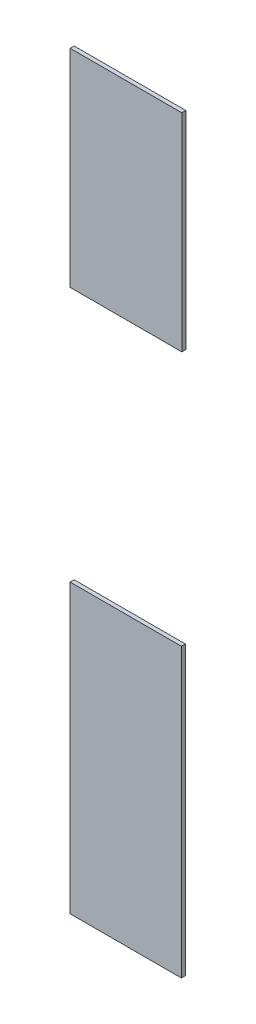
ISO-10303-21;
HEADER;
FILE_DESCRIPTION(('STEP AP214'),'2;1');
FILE_NAME('part.step','',(''),(''),'','','');
FILE_SCHEMA(('AUTOMOTIVE_DESIGN { 1 0 10303 214 1 1 1 1 }'));
ENDSEC;
DATA;
#1=APPLICATION_CONTEXT('core data for automotive mechanical design processes');
#2=APPLICATION_PROTOCOL_DEFINITION('international standard','automotive_design',2000,#1);
#3=PRODUCT_CONTEXT('',#1,'mechanical');
#4=PRODUCT('Part','Part','',(#3));
#5=PRODUCT_RELATED_PRODUCT_CATEGORY('part','',(#4));
#6=PRODUCT_DEFINITION_FORMATION('','',#4);
#7=PRODUCT_DEFINITION_CONTEXT('part definition',#1,'design');
#8=PRODUCT_DEFINITION('design','',#6,#7);
#9=PRODUCT_DEFINITION_SHAPE('','',#8);
#10=(LENGTH_UNIT() NAMED_UNIT(*) SI_UNIT(.MILLI.,.METRE.));
#11=(NAMED_UNIT(*) PLANE_ANGLE_UNIT() SI_UNIT($,.RADIAN.));
#12=(NAMED_UNIT(*) SI_UNIT($,.STERADIAN.) SOLID_ANGLE_UNIT());
#13=UNCERTAINTY_MEASURE_WITH_UNIT(LENGTH_MEASURE(1.E-05),#10,'distance_accuracy_value','');
#14=(GEOMETRIC_REPRESENTATION_CONTEXT(3) GLOBAL_UNCERTAINTY_ASSIGNED_CONTEXT((#13)) GLOBAL_UNIT_ASSIGNED_CONTEXT((#10,
#11,#12)) REPRESENTATION_CONTEXT('',''));
#15=CARTESIAN_POINT('',(0.,0.,0.));
#16=DIRECTION('',(0.,0.,1.));
#17=DIRECTION('',(1.,0.,0.));
#18=AXIS2_PLACEMENT_3D('',#15,#16,#17);
#19=CARTESIAN_POINT('',(-1.50000000000043,-1449.25,12.5));
#20=DIRECTION('',(-1.,0.,0.));
#21=DIRECTION('',(0.,0.,1.));
#22=AXIS2_PLACEMENT_3D('',#19,#20,#21);
#23=PLANE('',#22);
#24=DIRECTION('',(0.,1.,0.));
#25=VECTOR('',#24,1.);
#26=CARTESIAN_POINT('',(-1.50000000000043,-1449.25,0.));
#27=LINE('',#26,#25);
#28=CARTESIAN_POINT('',(-1.50000000000043,-2350.,0.));
#29=VERTEX_POINT('',#28);
#30=CARTESIAN_POINT('',(-1.50000000000043,-1449.25,0.));
#31=VERTEX_POINT('',#30);
#32=EDGE_CURVE('E108',#29,#31,#27,.T.);
#33=ORIENTED_EDGE('',*,*,#32,.T.);
#34=DIRECTION('',(0.,0.,-1.));
#35=VECTOR('',#34,1.);
#36=CARTESIAN_POINT('',(-1.50000000000043,-1449.25,12.5));
#37=LINE('',#36,#35);
#38=CARTESIAN_POINT('',(-1.50000000000043,-1449.25,12.5));
#39=VERTEX_POINT('',#38);
#40=EDGE_CURVE('E12',#39,#31,#37,.T.);
#41=ORIENTED_EDGE('',*,*,#40,.F.);
#42=DIRECTION('',(0.,1.,0.));
#43=VECTOR('',#42,1.);
#44=CARTESIAN_POINT('',(-1.50000000000043,-1449.25,12.5));
#45=LINE('',#44,#43);
#46=CARTESIAN_POINT('',(-1.50000000000043,-2350.,12.5));
#47=VERTEX_POINT('',#46);
#48=EDGE_CURVE('E96',#47,#39,#45,.T.);
#49=ORIENTED_EDGE('',*,*,#48,.F.);
#50=DIRECTION('',(0.,0.,-1.));
#51=VECTOR('',#50,1.);
#52=CARTESIAN_POINT('',(-1.50000000000043,-2350.,12.5));
#53=LINE('',#52,#51);
#54=EDGE_CURVE('E104',#47,#29,#53,.T.);
#55=ORIENTED_EDGE('',*,*,#54,.T.);
#56=EDGE_LOOP('',(#33,#41,#49,#55));
#57=FACE_BOUND('',#56,.T.);
#58=ADVANCED_FACE('F45',(#57),#23,.F.);
#59=CARTESIAN_POINT('',(-1.50000000000043,-1449.25,12.5));
#60=DIRECTION('',(0.,-1.,0.));
#61=DIRECTION('',(0.,0.,-1.));
#62=AXIS2_PLACEMENT_3D('',#59,#60,#61);
#63=PLANE('',#62);
#64=DIRECTION('',(-1.,0.,0.));
#65=VECTOR('',#64,1.);
#66=CARTESIAN_POINT('',(-1.50000000000043,-1449.25,0.));
#67=LINE('',#66,#65);
#68=CARTESIAN_POINT('',(-350.000000000002,-1449.25,0.));
#69=VERTEX_POINT('',#68);
#70=EDGE_CURVE('E100',#31,#69,#67,.T.);
#71=ORIENTED_EDGE('',*,*,#70,.T.);
#72=DIRECTION('',(0.,0.,-1.));
#73=VECTOR('',#72,1.);
#74=CARTESIAN_POINT('',(-350.000000000002,-1449.25,12.5));
#75=LINE('',#74,#73);
#76=CARTESIAN_POINT('',(-350.000000000002,-1449.25,12.5));
#77=VERTEX_POINT('',#76);
#78=EDGE_CURVE('E53',#77,#69,#75,.T.);
#79=ORIENTED_EDGE('',*,*,#78,.F.);
#80=DIRECTION('',(-1.,0.,0.));
#81=VECTOR('',#80,1.);
#82=CARTESIAN_POINT('',(-1.50000000000043,-1449.25,12.5));
#83=LINE('',#82,#81);
#84=EDGE_CURVE('E91',#39,#77,#83,.T.);
#85=ORIENTED_EDGE('',*,*,#84,.F.);
#86=ORIENTED_EDGE('',*,*,#40,.T.);
#87=EDGE_LOOP('',(#71,#79,#85,#86));
#88=FACE_BOUND('',#87,.T.);
#89=ADVANCED_FACE('F99',(#88),#63,.F.);
#90=CARTESIAN_POINT('',(-350.000000000002,-1449.25,12.5));
#91=DIRECTION('',(1.,0.,0.));
#92=DIRECTION('',(0.,0.,-1.));
#93=AXIS2_PLACEMENT_3D('',#90,#91,#92);
#94=PLANE('',#93);
#95=DIRECTION('',(0.,-1.,0.));
#96=VECTOR('',#95,1.);
#97=CARTESIAN_POINT('',(-350.000000000002,-1449.25,0.));
#98=LINE('',#97,#96);
#99=CARTESIAN_POINT('',(-350.000000000002,-2350.,0.));
#100=VERTEX_POINT('',#99);
#101=EDGE_CURVE('E78',#69,#100,#98,.T.);
#102=ORIENTED_EDGE('',*,*,#101,.T.);
#103=DIRECTION('',(0.,0.,-1.));
#104=VECTOR('',#103,1.);
#105=CARTESIAN_POINT('',(-350.000000000002,-2350.,12.5));
#106=LINE('',#105,#104);
#107=CARTESIAN_POINT('',(-350.000000000002,-2350.,12.5));
#108=VERTEX_POINT('',#107);
#109=EDGE_CURVE('E101',#108,#100,#106,.T.);
#110=ORIENTED_EDGE('',*,*,#109,.F.);
#111=DIRECTION('',(0.,-1.,0.));
#112=VECTOR('',#111,1.);
#113=CARTESIAN_POINT('',(-350.000000000002,-1449.25,12.5));
#114=LINE('',#113,#112);
#115=EDGE_CURVE('E94',#77,#108,#114,.T.);
#116=ORIENTED_EDGE('',*,*,#115,.F.);
#117=ORIENTED_EDGE('',*,*,#78,.T.);
#118=EDGE_LOOP('',(#102,#110,#116,#117));
#119=FACE_BOUND('',#118,.T.);
#120=ADVANCED_FACE('F102',(#119),#94,.F.);
#121=CARTESIAN_POINT('',(-1.50000000000043,-2350.,12.5));
#122=DIRECTION('',(0.,1.,0.));
#123=DIRECTION('',(0.,0.,1.));
#124=AXIS2_PLACEMENT_3D('',#121,#122,#123);
#125=PLANE('',#124);
#126=DIRECTION('',(1.,0.,0.));
#127=VECTOR('',#126,1.);
#128=CARTESIAN_POINT('',(-1.50000000000043,-2350.,0.));
#129=LINE('',#128,#127);
#130=EDGE_CURVE('E84',#100,#29,#129,.T.);
#131=ORIENTED_EDGE('',*,*,#130,.T.);
#132=ORIENTED_EDGE('',*,*,#54,.F.);
#133=DIRECTION('',(1.,0.,0.));
#134=VECTOR('',#133,1.);
#135=CARTESIAN_POINT('',(-1.50000000000043,-2350.,12.5));
#136=LINE('',#135,#134);
#137=EDGE_CURVE('E61',#108,#47,#136,.T.);
#138=ORIENTED_EDGE('',*,*,#137,.F.);
#139=ORIENTED_EDGE('',*,*,#109,.T.);
#140=EDGE_LOOP('',(#131,#132,#138,#139));
#141=FACE_BOUND('',#140,.T.);
#142=ADVANCED_FACE('F115',(#141),#125,.F.);
#143=CARTESIAN_POINT('',(0.,0.,12.5));
#144=DIRECTION('',(0.,0.,-1.));
#145=DIRECTION('',(-1.,0.,0.));
#146=AXIS2_PLACEMENT_3D('',#143,#144,#145);
#147=PLANE('',#146);
#148=ORIENTED_EDGE('',*,*,#48,.T.);
#149=ORIENTED_EDGE('',*,*,#84,.T.);
#150=ORIENTED_EDGE('',*,*,#115,.T.);
#151=ORIENTED_EDGE('',*,*,#137,.T.);
#152=EDGE_LOOP('',(#148,#149,#150,#151));
#153=FACE_BOUND('',#152,.T.);
#154=ADVANCED_FACE('F92',(#153),#147,.F.);
#155=CARTESIAN_POINT('',(0.,0.,0.));
#156=DIRECTION('',(0.,0.,-1.));
#157=DIRECTION('',(-1.,0.,0.));
#158=AXIS2_PLACEMENT_3D('',#155,#156,#157);
#159=PLANE('',#158);
#160=ORIENTED_EDGE('',*,*,#32,.F.);
#161=ORIENTED_EDGE('',*,*,#130,.F.);
#162=ORIENTED_EDGE('',*,*,#101,.F.);
#163=ORIENTED_EDGE('',*,*,#70,.F.);
#164=EDGE_LOOP('',(#160,#161,#162,#163));
#165=FACE_BOUND('',#164,.T.);
#166=ADVANCED_FACE('F118',(#165),#159,.T.);
#167=CLOSED_SHELL('',(#58,#89,#120,#142,#154,#166));
#168=MANIFOLD_SOLID_BREP('B2',#167);
#169=CARTESIAN_POINT('',(0.,0.,12.5));
#170=DIRECTION('',(-1.,0.,0.));
#171=DIRECTION('',(0.,-1.,0.));
#172=AXIS2_PLACEMENT_3D('',#169,#170,#171);
#173=PLANE('',#172);
#174=DIRECTION('',(0.,1.,0.));
#175=VECTOR('',#174,1.);
#176=CARTESIAN_POINT('',(0.,0.,0.));
#177=LINE('',#176,#175);
#178=CARTESIAN_POINT('',(0.,-649.25,0.));
#179=VERTEX_POINT('',#178);
#180=CARTESIAN_POINT('',(0.,0.,0.));
#181=VERTEX_POINT('',#180);
#182=EDGE_CURVE('E232',#179,#181,#177,.T.);
#183=ORIENTED_EDGE('',*,*,#182,.T.);
#184=DIRECTION('',(0.,0.,-1.));
#185=VECTOR('',#184,1.);
#186=CARTESIAN_POINT('',(0.,0.,12.5));
#187=LINE('',#186,#185);
#188=CARTESIAN_POINT('',(0.,0.,12.5));
#189=VERTEX_POINT('',#188);
#190=EDGE_CURVE('E43',#189,#181,#187,.T.);
#191=ORIENTED_EDGE('',*,*,#190,.F.);
#192=DIRECTION('',(0.,1.,0.));
#193=VECTOR('',#192,1.);
#194=CARTESIAN_POINT('',(0.,0.,12.5));
#195=LINE('',#194,#193);
#196=CARTESIAN_POINT('',(0.,-649.25,12.5));
#197=VERTEX_POINT('',#196);
#198=EDGE_CURVE('E220',#197,#189,#195,.T.);
#199=ORIENTED_EDGE('',*,*,#198,.F.);
#200=DIRECTION('',(0.,0.,-1.));
#201=VECTOR('',#200,1.);
#202=CARTESIAN_POINT('',(0.,-649.25,12.5));
#203=LINE('',#202,#201);
#204=EDGE_CURVE('E228',#197,#179,#203,.T.);
#205=ORIENTED_EDGE('',*,*,#204,.T.);
#206=EDGE_LOOP('',(#183,#191,#199,#205));
#207=FACE_BOUND('',#206,.T.);
#208=ADVANCED_FACE('F169',(#207),#173,.F.);
#209=CARTESIAN_POINT('',(0.,0.,12.5));
#210=DIRECTION('',(0.,-1.,0.));
#211=DIRECTION('',(0.,0.,-1.));
#212=AXIS2_PLACEMENT_3D('',#209,#210,#211);
#213=PLANE('',#212);
#214=DIRECTION('',(-1.,0.,0.));
#215=VECTOR('',#214,1.);
#216=CARTESIAN_POINT('',(0.,0.,0.));
#217=LINE('',#216,#215);
#218=CARTESIAN_POINT('',(-350.000000000002,0.,0.));
#219=VERTEX_POINT('',#218);
#220=EDGE_CURVE('E224',#181,#219,#217,.T.);
#221=ORIENTED_EDGE('',*,*,#220,.T.);
#222=DIRECTION('',(0.,0.,-1.));
#223=VECTOR('',#222,1.);
#224=CARTESIAN_POINT('',(-350.000000000002,0.,12.5));
#225=LINE('',#224,#223);
#226=CARTESIAN_POINT('',(-350.000000000002,0.,12.5));
#227=VERTEX_POINT('',#226);
#228=EDGE_CURVE('E177',#227,#219,#225,.T.);
#229=ORIENTED_EDGE('',*,*,#228,.F.);
#230=DIRECTION('',(-1.,0.,0.));
#231=VECTOR('',#230,1.);
#232=CARTESIAN_POINT('',(0.,0.,12.5));
#233=LINE('',#232,#231);
#234=EDGE_CURVE('E215',#189,#227,#233,.T.);
#235=ORIENTED_EDGE('',*,*,#234,.F.);
#236=ORIENTED_EDGE('',*,*,#190,.T.);
#237=EDGE_LOOP('',(#221,#229,#235,#236));
#238=FACE_BOUND('',#237,.T.);
#239=ADVANCED_FACE('F223',(#238),#213,.F.);
#240=CARTESIAN_POINT('',(-350.000000000002,0.,12.5));
#241=DIRECTION('',(1.,0.,0.));
#242=DIRECTION('',(0.,0.,-1.));
#243=AXIS2_PLACEMENT_3D('',#240,#241,#242);
#244=PLANE('',#243);
#245=DIRECTION('',(0.,-1.,0.));
#246=VECTOR('',#245,1.);
#247=CARTESIAN_POINT('',(-350.000000000002,0.,0.));
#248=LINE('',#247,#246);
#249=CARTESIAN_POINT('',(-350.000000000002,-649.25,0.));
#250=VERTEX_POINT('',#249);
#251=EDGE_CURVE('E202',#219,#250,#248,.T.);
#252=ORIENTED_EDGE('',*,*,#251,.T.);
#253=DIRECTION('',(0.,0.,-1.));
#254=VECTOR('',#253,1.);
#255=CARTESIAN_POINT('',(-350.000000000002,-649.25,12.5));
#256=LINE('',#255,#254);
#257=CARTESIAN_POINT('',(-350.000000000002,-649.25,12.5));
#258=VERTEX_POINT('',#257);
#259=EDGE_CURVE('E225',#258,#250,#256,.T.);
#260=ORIENTED_EDGE('',*,*,#259,.F.);
#261=DIRECTION('',(0.,-1.,0.));
#262=VECTOR('',#261,1.);
#263=CARTESIAN_POINT('',(-350.000000000002,0.,12.5));
#264=LINE('',#263,#262);
#265=EDGE_CURVE('E218',#227,#258,#264,.T.);
#266=ORIENTED_EDGE('',*,*,#265,.F.);
#267=ORIENTED_EDGE('',*,*,#228,.T.);
#268=EDGE_LOOP('',(#252,#260,#266,#267));
#269=FACE_BOUND('',#268,.T.);
#270=ADVANCED_FACE('F226',(#269),#244,.F.);
#271=CARTESIAN_POINT('',(0.,-649.25,12.5));
#272=DIRECTION('',(0.,1.,0.));
#273=DIRECTION('',(0.,0.,1.));
#274=AXIS2_PLACEMENT_3D('',#271,#272,#273);
#275=PLANE('',#274);
#276=DIRECTION('',(1.,0.,0.));
#277=VECTOR('',#276,1.);
#278=CARTESIAN_POINT('',(0.,-649.25,0.));
#279=LINE('',#278,#277);
#280=EDGE_CURVE('E208',#250,#179,#279,.T.);
#281=ORIENTED_EDGE('',*,*,#280,.T.);
#282=ORIENTED_EDGE('',*,*,#204,.F.);
#283=DIRECTION('',(1.,0.,0.));
#284=VECTOR('',#283,1.);
#285=CARTESIAN_POINT('',(0.,-649.25,12.5));
#286=LINE('',#285,#284);
#287=EDGE_CURVE('E185',#258,#197,#286,.T.);
#288=ORIENTED_EDGE('',*,*,#287,.F.);
#289=ORIENTED_EDGE('',*,*,#259,.T.);
#290=EDGE_LOOP('',(#281,#282,#288,#289));
#291=FACE_BOUND('',#290,.T.);
#292=ADVANCED_FACE('F239',(#291),#275,.F.);
#293=CARTESIAN_POINT('',(0.,0.,12.5));
#294=DIRECTION('',(0.,0.,-1.));
#295=DIRECTION('',(-1.,0.,0.));
#296=AXIS2_PLACEMENT_3D('',#293,#294,#295);
#297=PLANE('',#296);
#298=ORIENTED_EDGE('',*,*,#198,.T.);
#299=ORIENTED_EDGE('',*,*,#234,.T.);
#300=ORIENTED_EDGE('',*,*,#265,.T.);
#301=ORIENTED_EDGE('',*,*,#287,.T.);
#302=EDGE_LOOP('',(#298,#299,#300,#301));
#303=FACE_BOUND('',#302,.T.);
#304=ADVANCED_FACE('F216',(#303),#297,.F.);
#305=CARTESIAN_POINT('',(0.,0.,0.));
#306=DIRECTION('',(0.,0.,-1.));
#307=DIRECTION('',(-1.,0.,0.));
#308=AXIS2_PLACEMENT_3D('',#305,#306,#307);
#309=PLANE('',#308);
#310=ORIENTED_EDGE('',*,*,#182,.F.);
#311=ORIENTED_EDGE('',*,*,#280,.F.);
#312=ORIENTED_EDGE('',*,*,#251,.F.);
#313=ORIENTED_EDGE('',*,*,#220,.F.);
#314=EDGE_LOOP('',(#310,#311,#312,#313));
#315=FACE_BOUND('',#314,.T.);
#316=ADVANCED_FACE('F242',(#315),#309,.T.);
#317=CLOSED_SHELL('',(#208,#239,#270,#292,#304,#316));
#318=MANIFOLD_SOLID_BREP('B6',#317);
#319=ADVANCED_BREP_SHAPE_REPRESENTATION('',(#18,#168,#318),#14);
#320=SHAPE_DEFINITION_REPRESENTATION(#9,#319);
ENDSEC;
END-ISO-10303-21;
